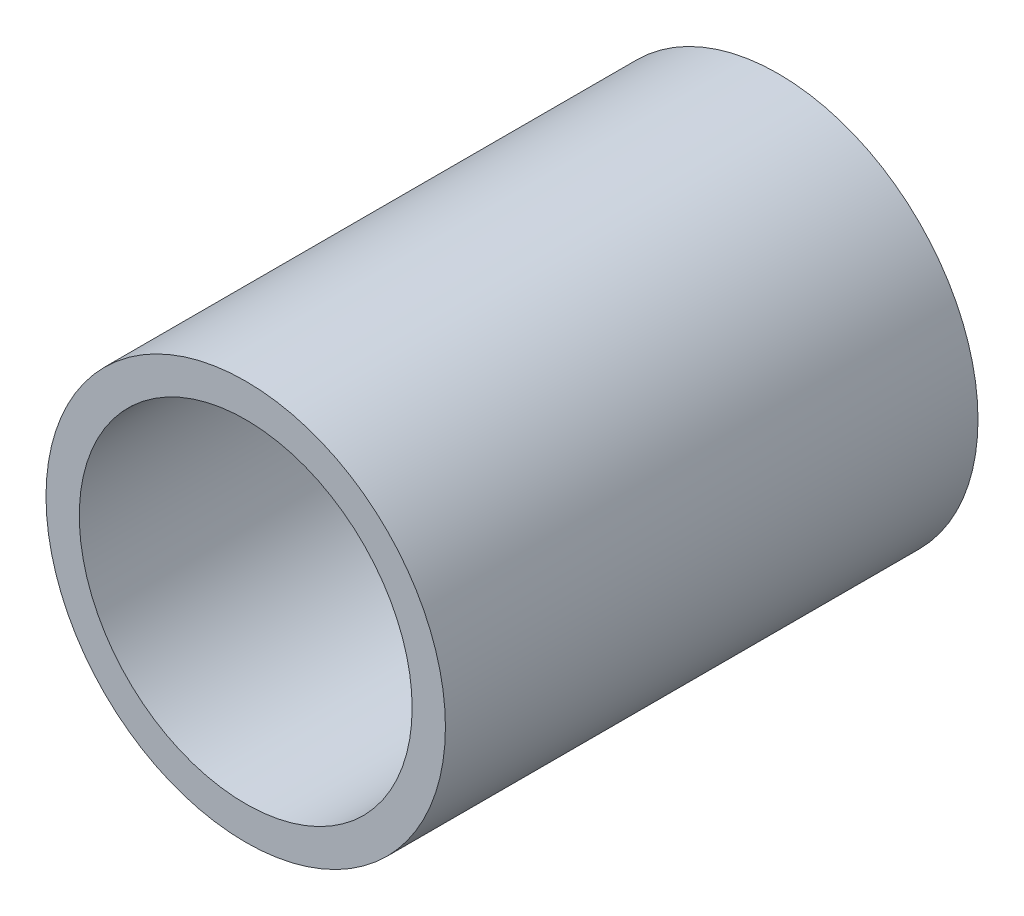
ISO-10303-21;
HEADER;
FILE_DESCRIPTION(('STEP AP214'),'2;1');
FILE_NAME('part.step','',(''),(''),'','','');
FILE_SCHEMA(('AUTOMOTIVE_DESIGN { 1 0 10303 214 1 1 1 1 }'));
ENDSEC;
DATA;
#1=APPLICATION_CONTEXT('core data for automotive mechanical design processes');
#2=APPLICATION_PROTOCOL_DEFINITION('international standard','automotive_design',2000,#1);
#3=PRODUCT_CONTEXT('',#1,'mechanical');
#4=PRODUCT('Part','Part','',(#3));
#5=PRODUCT_RELATED_PRODUCT_CATEGORY('part','',(#4));
#6=PRODUCT_DEFINITION_FORMATION('','',#4);
#7=PRODUCT_DEFINITION_CONTEXT('part definition',#1,'design');
#8=PRODUCT_DEFINITION('design','',#6,#7);
#9=PRODUCT_DEFINITION_SHAPE('','',#8);
#10=(LENGTH_UNIT() NAMED_UNIT(*) SI_UNIT(.MILLI.,.METRE.));
#11=(NAMED_UNIT(*) PLANE_ANGLE_UNIT() SI_UNIT($,.RADIAN.));
#12=(NAMED_UNIT(*) SI_UNIT($,.STERADIAN.) SOLID_ANGLE_UNIT());
#13=UNCERTAINTY_MEASURE_WITH_UNIT(LENGTH_MEASURE(1.E-05),#10,'distance_accuracy_value','');
#14=(GEOMETRIC_REPRESENTATION_CONTEXT(3) GLOBAL_UNCERTAINTY_ASSIGNED_CONTEXT((#13)) GLOBAL_UNIT_ASSIGNED_CONTEXT((#10,
#11,#12)) REPRESENTATION_CONTEXT('',''));
#15=CARTESIAN_POINT('',(0.,0.,0.));
#16=DIRECTION('',(0.,0.,1.));
#17=DIRECTION('',(1.,0.,0.));
#18=AXIS2_PLACEMENT_3D('',#15,#16,#17);
#19=CARTESIAN_POINT('',(0.,0.,6.35));
#20=DIRECTION('',(0.,0.,1.));
#21=DIRECTION('',(1.,0.,0.));
#22=AXIS2_PLACEMENT_3D('',#19,#20,#21);
#23=PLANE('',#22);
#24=CARTESIAN_POINT('',(0.,0.,6.35));
#25=DIRECTION('',(0.,0.,1.));
#26=DIRECTION('',(1.,0.,0.));
#27=AXIS2_PLACEMENT_3D('',#24,#25,#26);
#28=CIRCLE('',#27,4.7625);
#29=CARTESIAN_POINT('',(4.7625,0.,6.35));
#30=VERTEX_POINT('',#29);
#31=EDGE_CURVE('E10',#30,#30,#28,.T.);
#32=ORIENTED_EDGE('',*,*,#31,.T.);
#33=EDGE_LOOP('',(#32));
#34=FACE_BOUND('',#33,.T.);
#35=CARTESIAN_POINT('',(0.,0.,6.35));
#36=DIRECTION('',(0.,0.,1.));
#37=DIRECTION('',(1.,0.,0.));
#38=AXIS2_PLACEMENT_3D('',#35,#36,#37);
#39=CIRCLE('',#38,3.96875);
#40=CARTESIAN_POINT('',(3.96875,0.,6.35));
#41=VERTEX_POINT('',#40);
#42=EDGE_CURVE('E43',#41,#41,#39,.T.);
#43=ORIENTED_EDGE('',*,*,#42,.F.);
#44=EDGE_LOOP('',(#43));
#45=FACE_BOUND('',#44,.T.);
#46=ADVANCED_FACE('F32',(#34,#45),#23,.T.);
#47=CARTESIAN_POINT('',(0.,0.,-6.35));
#48=DIRECTION('',(0.,0.,1.));
#49=DIRECTION('',(1.,0.,0.));
#50=AXIS2_PLACEMENT_3D('',#47,#48,#49);
#51=PLANE('',#50);
#52=CARTESIAN_POINT('',(0.,0.,-6.35));
#53=DIRECTION('',(0.,0.,1.));
#54=DIRECTION('',(1.,0.,0.));
#55=AXIS2_PLACEMENT_3D('',#52,#53,#54);
#56=CIRCLE('',#55,4.7625);
#57=CARTESIAN_POINT('',(4.7625,0.,-6.35));
#58=VERTEX_POINT('',#57);
#59=EDGE_CURVE('E36',#58,#58,#56,.T.);
#60=ORIENTED_EDGE('',*,*,#59,.F.);
#61=EDGE_LOOP('',(#60));
#62=FACE_BOUND('',#61,.T.);
#63=CARTESIAN_POINT('',(0.,0.,-6.35));
#64=DIRECTION('',(0.,0.,1.));
#65=DIRECTION('',(1.,0.,0.));
#66=AXIS2_PLACEMENT_3D('',#63,#64,#65);
#67=CIRCLE('',#66,3.96875);
#68=CARTESIAN_POINT('',(3.96875,0.,-6.35));
#69=VERTEX_POINT('',#68);
#70=EDGE_CURVE('E45',#69,#69,#67,.T.);
#71=ORIENTED_EDGE('',*,*,#70,.T.);
#72=EDGE_LOOP('',(#71));
#73=FACE_BOUND('',#72,.T.);
#74=ADVANCED_FACE('F55',(#62,#73),#51,.F.);
#75=CARTESIAN_POINT('',(0.,0.,6.35));
#76=DIRECTION('',(0.,0.,-1.));
#77=DIRECTION('',(-1.,0.,0.));
#78=AXIS2_PLACEMENT_3D('',#75,#76,#77);
#79=CYLINDRICAL_SURFACE('',#78,4.7625);
#80=ORIENTED_EDGE('',*,*,#31,.F.);
#81=EDGE_LOOP('',(#80));
#82=FACE_BOUND('',#81,.T.);
#83=ORIENTED_EDGE('',*,*,#59,.T.);
#84=EDGE_LOOP('',(#83));
#85=FACE_BOUND('',#84,.T.);
#86=ADVANCED_FACE('F34',(#82,#85),#79,.T.);
#87=CARTESIAN_POINT('',(0.,0.,6.35));
#88=DIRECTION('',(0.,0.,-1.));
#89=DIRECTION('',(-1.,0.,0.));
#90=AXIS2_PLACEMENT_3D('',#87,#88,#89);
#91=CYLINDRICAL_SURFACE('',#90,3.96875);
#92=ORIENTED_EDGE('',*,*,#42,.T.);
#93=EDGE_LOOP('',(#92));
#94=FACE_BOUND('',#93,.T.);
#95=ORIENTED_EDGE('',*,*,#70,.F.);
#96=EDGE_LOOP('',(#95));
#97=FACE_BOUND('',#96,.T.);
#98=ADVANCED_FACE('F51',(#94,#97),#91,.F.);
#99=CLOSED_SHELL('',(#46,#74,#86,#98));
#100=MANIFOLD_SOLID_BREP('B2',#99);
#101=ADVANCED_BREP_SHAPE_REPRESENTATION('',(#18,#100),#14);
#102=SHAPE_DEFINITION_REPRESENTATION(#9,#101);
ENDSEC;
END-ISO-10303-21;
